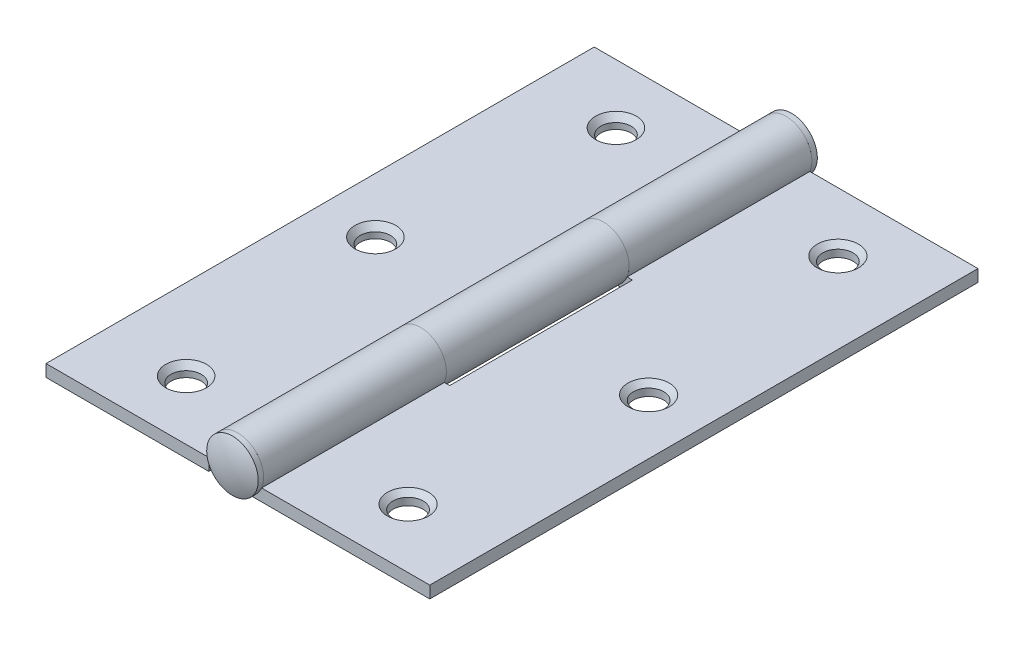
ISO-10303-21;
HEADER;
FILE_DESCRIPTION(('STEP AP214'),'2;1');
FILE_NAME('part.step','',(''),(''),'','','');
FILE_SCHEMA(('AUTOMOTIVE_DESIGN { 1 0 10303 214 1 1 1 1 }'));
ENDSEC;
DATA;
#1=APPLICATION_CONTEXT('core data for automotive mechanical design processes');
#2=APPLICATION_PROTOCOL_DEFINITION('international standard','automotive_design',2000,#1);
#3=PRODUCT_CONTEXT('',#1,'mechanical');
#4=PRODUCT('Part','Part','',(#3));
#5=PRODUCT_RELATED_PRODUCT_CATEGORY('part','',(#4));
#6=PRODUCT_DEFINITION_FORMATION('','',#4);
#7=PRODUCT_DEFINITION_CONTEXT('part definition',#1,'design');
#8=PRODUCT_DEFINITION('design','',#6,#7);
#9=PRODUCT_DEFINITION_SHAPE('','',#8);
#10=(LENGTH_UNIT() NAMED_UNIT(*) SI_UNIT(.MILLI.,.METRE.));
#11=(NAMED_UNIT(*) PLANE_ANGLE_UNIT() SI_UNIT($,.RADIAN.));
#12=(NAMED_UNIT(*) SI_UNIT($,.STERADIAN.) SOLID_ANGLE_UNIT());
#13=UNCERTAINTY_MEASURE_WITH_UNIT(LENGTH_MEASURE(1.E-05),#10,'distance_accuracy_value','');
#14=(GEOMETRIC_REPRESENTATION_CONTEXT(3) GLOBAL_UNCERTAINTY_ASSIGNED_CONTEXT((#13)) GLOBAL_UNIT_ASSIGNED_CONTEXT((#10,
#11,#12)) REPRESENTATION_CONTEXT('',''));
#15=CARTESIAN_POINT('',(0.,0.,0.));
#16=DIRECTION('',(0.,0.,1.));
#17=DIRECTION('',(1.,0.,0.));
#18=AXIS2_PLACEMENT_3D('',#15,#16,#17);
#19=CARTESIAN_POINT('',(0.,0.,-19.2983468731966));
#20=DIRECTION('',(0.,0.,1.));
#21=DIRECTION('',(1.,0.,0.));
#22=AXIS2_PLACEMENT_3D('',#19,#20,#21);
#23=CYLINDRICAL_SURFACE('',#22,2.9845);
#24=DIRECTION('',(0.,0.,1.));
#25=VECTOR('',#24,1.);
#26=CARTESIAN_POINT('',(-1.524,-2.56606006359945,-19.2983468731966));
#27=LINE('',#26,#25);
#28=CARTESIAN_POINT('',(-1.524,-2.56606006359945,-10.5833333333333));
#29=VERTEX_POINT('',#28);
#30=CARTESIAN_POINT('',(-1.524,-2.56606006359945,10.5833333333333));
#31=VERTEX_POINT('',#30);
#32=EDGE_CURVE('E209',#29,#31,#27,.T.);
#33=ORIENTED_EDGE('',*,*,#32,.F.);
#34=CARTESIAN_POINT('',(0.,0.,-10.5833333333333));
#35=DIRECTION('',(0.,0.,-1.));
#36=DIRECTION('',(-1.,0.,0.));
#37=AXIS2_PLACEMENT_3D('',#34,#35,#36);
#38=CIRCLE('',#37,2.9845);
#39=CARTESIAN_POINT('',(-2.74600415471223,-1.16906006359945,-10.5833333333333));
#40=VERTEX_POINT('',#39);
#41=EDGE_CURVE('E67',#29,#40,#38,.F.);
#42=ORIENTED_EDGE('',*,*,#41,.T.);
#43=DIRECTION('',(0.,0.,1.));
#44=VECTOR('',#43,1.);
#45=CARTESIAN_POINT('',(-2.74600415471223,-1.16906006359945,-19.2983468731966));
#46=LINE('',#45,#44);
#47=CARTESIAN_POINT('',(-2.74600415471223,-1.16906006359945,10.5833333333333));
#48=VERTEX_POINT('',#47);
#49=EDGE_CURVE('E51',#40,#48,#46,.T.);
#50=ORIENTED_EDGE('',*,*,#49,.T.);
#51=CARTESIAN_POINT('',(0.,0.,10.5833333333333));
#52=DIRECTION('',(0.,0.,1.));
#53=DIRECTION('',(1.,0.,0.));
#54=AXIS2_PLACEMENT_3D('',#51,#52,#53);
#55=CIRCLE('',#54,2.9845);
#56=EDGE_CURVE('E189',#31,#48,#55,.T.);
#57=ORIENTED_EDGE('',*,*,#56,.F.);
#58=EDGE_LOOP('',(#33,#42,#50,#57));
#59=FACE_BOUND('',#58,.T.);
#60=ADVANCED_FACE('F47',(#59),#23,.T.);
#61=CARTESIAN_POINT('',(-3.3655,-2.56606006359945,-19.2983468731966));
#62=DIRECTION('',(0.,-1.,0.));
#63=DIRECTION('',(1.,0.,0.));
#64=AXIS2_PLACEMENT_3D('',#61,#62,#63);
#65=PLANE('',#64);
#66=DIRECTION('',(1.,0.,0.));
#67=VECTOR('',#66,1.);
#68=CARTESIAN_POINT('',(-3.3655,-2.56606006359945,10.5833333333333));
#69=LINE('',#68,#67);
#70=CARTESIAN_POINT('',(-3.3655,-2.56606006359945,10.5833333333333));
#71=VERTEX_POINT('',#70);
#72=EDGE_CURVE('E192',#71,#31,#69,.T.);
#73=ORIENTED_EDGE('',*,*,#72,.F.);
#74=DIRECTION('',(0.,0.,1.));
#75=VECTOR('',#74,1.);
#76=CARTESIAN_POINT('',(-3.3655,-2.56606006359945,-31.75));
#77=LINE('',#76,#75);
#78=CARTESIAN_POINT('',(-3.3655,-2.56606006359945,31.75));
#79=VERTEX_POINT('',#78);
#80=EDGE_CURVE('E164',#71,#79,#77,.T.);
#81=ORIENTED_EDGE('',*,*,#80,.T.);
#82=DIRECTION('',(1.,0.,0.));
#83=VECTOR('',#82,1.);
#84=CARTESIAN_POINT('',(-22.225,-2.56606006359945,31.75));
#85=LINE('',#84,#83);
#86=CARTESIAN_POINT('',(-22.225,-2.56606006359945,31.75));
#87=VERTEX_POINT('',#86);
#88=EDGE_CURVE('E135',#87,#79,#85,.T.);
#89=ORIENTED_EDGE('',*,*,#88,.F.);
#90=DIRECTION('',(0.,0.,1.));
#91=VECTOR('',#90,1.);
#92=CARTESIAN_POINT('',(-22.225,-2.56606006359945,-31.75));
#93=LINE('',#92,#91);
#94=CARTESIAN_POINT('',(-22.225,-2.56606006359945,-31.75));
#95=VERTEX_POINT('',#94);
#96=EDGE_CURVE('E126',#95,#87,#93,.T.);
#97=ORIENTED_EDGE('',*,*,#96,.F.);
#98=DIRECTION('',(1.,0.,0.));
#99=VECTOR('',#98,1.);
#100=CARTESIAN_POINT('',(-22.225,-2.56606006359945,-31.75));
#101=LINE('',#100,#99);
#102=CARTESIAN_POINT('',(-3.3655,-2.56606006359945,-31.75));
#103=VERTEX_POINT('',#102);
#104=EDGE_CURVE('E152',#95,#103,#101,.T.);
#105=ORIENTED_EDGE('',*,*,#104,.T.);
#106=CARTESIAN_POINT('',(-3.3655,-2.56606006359945,-10.5833333333333));
#107=VERTEX_POINT('',#106);
#108=EDGE_CURVE('E161',#103,#107,#77,.T.);
#109=ORIENTED_EDGE('',*,*,#108,.T.);
#110=DIRECTION('',(1.,0.,0.));
#111=VECTOR('',#110,1.);
#112=CARTESIAN_POINT('',(-3.3655,-2.56606006359945,-10.5833333333333));
#113=LINE('',#112,#111);
#114=EDGE_CURVE('E206',#107,#29,#113,.T.);
#115=ORIENTED_EDGE('',*,*,#114,.T.);
#116=ORIENTED_EDGE('',*,*,#32,.T.);
#117=EDGE_LOOP('',(#73,#81,#89,#97,#105,#109,#115,#116));
#118=FACE_BOUND('',#117,.T.);
#119=CARTESIAN_POINT('',(-12.8524,-2.56606006359945,-24.892));
#120=DIRECTION('',(0.,-1.,0.));
#121=DIRECTION('',(0.,0.,-1.));
#122=AXIS2_PLACEMENT_3D('',#119,#120,#121);
#123=CIRCLE('',#122,1.7526);
#124=CARTESIAN_POINT('',(-12.8524,-2.56606006359945,-26.6446));
#125=VERTEX_POINT('',#124);
#126=EDGE_CURVE('E141',#125,#125,#123,.T.);
#127=ORIENTED_EDGE('',*,*,#126,.F.);
#128=EDGE_LOOP('',(#127));
#129=FACE_BOUND('',#128,.T.);
#130=CARTESIAN_POINT('',(-12.8524,-2.56606006359945,24.892));
#131=DIRECTION('',(0.,-1.,0.));
#132=DIRECTION('',(0.,0.,-1.));
#133=AXIS2_PLACEMENT_3D('',#130,#131,#132);
#134=CIRCLE('',#133,1.7526);
#135=CARTESIAN_POINT('',(-12.8524,-2.56606006359945,23.1394));
#136=VERTEX_POINT('',#135);
#137=EDGE_CURVE('E144',#136,#136,#134,.T.);
#138=ORIENTED_EDGE('',*,*,#137,.F.);
#139=EDGE_LOOP('',(#138));
#140=FACE_BOUND('',#139,.T.);
#141=CARTESIAN_POINT('',(-15.8242,-2.56606006359945,0.));
#142=DIRECTION('',(0.,-1.,0.));
#143=DIRECTION('',(0.,0.,-1.));
#144=AXIS2_PLACEMENT_3D('',#141,#142,#143);
#145=CIRCLE('',#144,1.7526);
#146=CARTESIAN_POINT('',(-15.8242,-2.56606006359945,-1.7526));
#147=VERTEX_POINT('',#146);
#148=EDGE_CURVE('E166',#147,#147,#145,.T.);
#149=ORIENTED_EDGE('',*,*,#148,.F.);
#150=EDGE_LOOP('',(#149));
#151=FACE_BOUND('',#150,.T.);
#152=ADVANCED_FACE('F213',(#118,#129,#140,#151),#65,.T.);
#153=CARTESIAN_POINT('',(-2.74600415471223,-1.16906006359945,-19.2983468731966));
#154=DIRECTION('',(0.,1.,0.));
#155=DIRECTION('',(0.,0.,1.));
#156=AXIS2_PLACEMENT_3D('',#153,#154,#155);
#157=PLANE('',#156);
#158=ORIENTED_EDGE('',*,*,#49,.F.);
#159=DIRECTION('',(-1.,0.,0.));
#160=VECTOR('',#159,1.);
#161=CARTESIAN_POINT('',(-2.74600415471223,-1.16906006359945,-10.5833333333333));
#162=LINE('',#161,#160);
#163=CARTESIAN_POINT('',(-3.3655,-1.16906006359945,-10.5833333333333));
#164=VERTEX_POINT('',#163);
#165=EDGE_CURVE('E56',#40,#164,#162,.T.);
#166=ORIENTED_EDGE('',*,*,#165,.T.);
#167=DIRECTION('',(0.,0.,1.));
#168=VECTOR('',#167,1.);
#169=CARTESIAN_POINT('',(-3.3655,-1.16906006359945,-31.75));
#170=LINE('',#169,#168);
#171=CARTESIAN_POINT('',(-3.3655,-1.16906006359945,-31.75));
#172=VERTEX_POINT('',#171);
#173=EDGE_CURVE('E157',#172,#164,#170,.T.);
#174=ORIENTED_EDGE('',*,*,#173,.F.);
#175=DIRECTION('',(-1.,0.,0.));
#176=VECTOR('',#175,1.);
#177=CARTESIAN_POINT('',(-22.225,-1.16906006359945,-31.75));
#178=LINE('',#177,#176);
#179=CARTESIAN_POINT('',(-22.225,-1.16906006359945,-31.75));
#180=VERTEX_POINT('',#179);
#181=EDGE_CURVE('E122',#172,#180,#178,.T.);
#182=ORIENTED_EDGE('',*,*,#181,.T.);
#183=DIRECTION('',(0.,0.,1.));
#184=VECTOR('',#183,1.);
#185=CARTESIAN_POINT('',(-22.225,-1.16906006359945,-31.75));
#186=LINE('',#185,#184);
#187=CARTESIAN_POINT('',(-22.225,-1.16906006359945,31.75));
#188=VERTEX_POINT('',#187);
#189=EDGE_CURVE('E113',#180,#188,#186,.T.);
#190=ORIENTED_EDGE('',*,*,#189,.T.);
#191=DIRECTION('',(-1.,0.,0.));
#192=VECTOR('',#191,1.);
#193=CARTESIAN_POINT('',(-22.225,-1.16906006359945,31.75));
#194=LINE('',#193,#192);
#195=CARTESIAN_POINT('',(-3.3655,-1.16906006359945,31.75));
#196=VERTEX_POINT('',#195);
#197=EDGE_CURVE('E120',#196,#188,#194,.T.);
#198=ORIENTED_EDGE('',*,*,#197,.F.);
#199=CARTESIAN_POINT('',(-3.3655,-1.16906006359945,10.5833333333333));
#200=VERTEX_POINT('',#199);
#201=EDGE_CURVE('E160',#200,#196,#170,.T.);
#202=ORIENTED_EDGE('',*,*,#201,.F.);
#203=DIRECTION('',(-1.,0.,0.));
#204=VECTOR('',#203,1.);
#205=CARTESIAN_POINT('',(-2.74600415471223,-1.16906006359945,10.5833333333333));
#206=LINE('',#205,#204);
#207=EDGE_CURVE('E198',#48,#200,#206,.T.);
#208=ORIENTED_EDGE('',*,*,#207,.F.);
#209=EDGE_LOOP('',(#158,#166,#174,#182,#190,#198,#202,#208));
#210=FACE_BOUND('',#209,.T.);
#211=CARTESIAN_POINT('',(-12.8524,-1.16906006359945,-24.892));
#212=DIRECTION('',(0.,1.,0.));
#213=DIRECTION('',(0.,0.,1.));
#214=AXIS2_PLACEMENT_3D('',#211,#212,#213);
#215=CIRCLE('',#214,2.35979678636464);
#216=CARTESIAN_POINT('',(-12.8524,-1.16906006359945,-22.5322032136354));
#217=VERTEX_POINT('',#216);
#218=EDGE_CURVE('E179',#217,#217,#215,.F.);
#219=ORIENTED_EDGE('',*,*,#218,.T.);
#220=EDGE_LOOP('',(#219));
#221=FACE_BOUND('',#220,.T.);
#222=CARTESIAN_POINT('',(-15.8242,-1.16906006359945,0.));
#223=DIRECTION('',(0.,1.,0.));
#224=DIRECTION('',(0.,0.,1.));
#225=AXIS2_PLACEMENT_3D('',#222,#223,#224);
#226=CIRCLE('',#225,2.35979678636464);
#227=CARTESIAN_POINT('',(-15.8242,-1.16906006359945,2.35979678636464));
#228=VERTEX_POINT('',#227);
#229=EDGE_CURVE('E176',#228,#228,#226,.F.);
#230=ORIENTED_EDGE('',*,*,#229,.T.);
#231=EDGE_LOOP('',(#230));
#232=FACE_BOUND('',#231,.T.);
#233=CARTESIAN_POINT('',(-12.8524,-1.16906006359945,24.892));
#234=DIRECTION('',(0.,1.,0.));
#235=DIRECTION('',(0.,0.,1.));
#236=AXIS2_PLACEMENT_3D('',#233,#234,#235);
#237=CIRCLE('',#236,2.35979678636464);
#238=CARTESIAN_POINT('',(-12.8524,-1.16906006359945,27.2517967863646));
#239=VERTEX_POINT('',#238);
#240=EDGE_CURVE('E173',#239,#239,#237,.F.);
#241=ORIENTED_EDGE('',*,*,#240,.T.);
#242=EDGE_LOOP('',(#241));
#243=FACE_BOUND('',#242,.T.);
#244=ADVANCED_FACE('F116',(#210,#221,#232,#243),#157,.T.);
#245=CARTESIAN_POINT('',(0.,0.,-19.2983468731966));
#246=DIRECTION('',(0.,0.,1.));
#247=DIRECTION('',(1.,0.,0.));
#248=AXIS2_PLACEMENT_3D('',#245,#246,#247);
#249=CYLINDRICAL_SURFACE('',#248,1.524);
#250=CARTESIAN_POINT('',(0.,0.,-10.5833333333333));
#251=DIRECTION('',(0.,0.,-1.));
#252=DIRECTION('',(-1.,0.,0.));
#253=AXIS2_PLACEMENT_3D('',#250,#251,#252);
#254=CIRCLE('',#253,1.524);
#255=CARTESIAN_POINT('',(-1.524,0.,-10.5833333333333));
#256=VERTEX_POINT('',#255);
#257=EDGE_CURVE('E12',#256,#256,#254,.F.);
#258=ORIENTED_EDGE('',*,*,#257,.F.);
#259=EDGE_LOOP('',(#258));
#260=FACE_BOUND('',#259,.T.);
#261=CARTESIAN_POINT('',(0.,0.,10.5833333333333));
#262=DIRECTION('',(0.,0.,1.));
#263=DIRECTION('',(1.,0.,0.));
#264=AXIS2_PLACEMENT_3D('',#261,#262,#263);
#265=CIRCLE('',#264,1.524);
#266=CARTESIAN_POINT('',(1.524,0.,10.5833333333333));
#267=VERTEX_POINT('',#266);
#268=EDGE_CURVE('E188',#267,#267,#265,.T.);
#269=ORIENTED_EDGE('',*,*,#268,.T.);
#270=EDGE_LOOP('',(#269));
#271=FACE_BOUND('',#270,.T.);
#272=ADVANCED_FACE('F229',(#260,#271),#249,.F.);
#273=CARTESIAN_POINT('',(-3.3655,-2.9845,-10.5833333333333));
#274=DIRECTION('',(0.,0.,-1.));
#275=DIRECTION('',(-1.,0.,0.));
#276=AXIS2_PLACEMENT_3D('',#273,#274,#275);
#277=PLANE('',#276);
#278=ORIENTED_EDGE('',*,*,#41,.F.);
#279=ORIENTED_EDGE('',*,*,#114,.F.);
#280=DIRECTION('',(0.,-1.,0.));
#281=VECTOR('',#280,1.);
#282=CARTESIAN_POINT('',(-3.3655,-1.16906006359945,-10.5833333333333));
#283=LINE('',#282,#281);
#284=EDGE_CURVE('E204',#164,#107,#283,.T.);
#285=ORIENTED_EDGE('',*,*,#284,.F.);
#286=ORIENTED_EDGE('',*,*,#165,.F.);
#287=EDGE_LOOP('',(#278,#279,#285,#286));
#288=FACE_BOUND('',#287,.T.);
#289=ORIENTED_EDGE('',*,*,#257,.T.);
#290=EDGE_LOOP('',(#289));
#291=FACE_BOUND('',#290,.T.);
#292=ADVANCED_FACE('F49',(#288,#291),#277,.T.);
#293=CARTESIAN_POINT('',(-3.3655,-2.9845,10.5833333333333));
#294=DIRECTION('',(0.,0.,1.));
#295=DIRECTION('',(1.,0.,0.));
#296=AXIS2_PLACEMENT_3D('',#293,#294,#295);
#297=PLANE('',#296);
#298=ORIENTED_EDGE('',*,*,#268,.F.);
#299=EDGE_LOOP('',(#298));
#300=FACE_BOUND('',#299,.T.);
#301=ORIENTED_EDGE('',*,*,#56,.T.);
#302=ORIENTED_EDGE('',*,*,#207,.T.);
#303=DIRECTION('',(0.,-1.,0.));
#304=VECTOR('',#303,1.);
#305=CARTESIAN_POINT('',(-3.3655,-1.16906006359945,10.5833333333333));
#306=LINE('',#305,#304);
#307=EDGE_CURVE('E195',#200,#71,#306,.T.);
#308=ORIENTED_EDGE('',*,*,#307,.T.);
#309=ORIENTED_EDGE('',*,*,#72,.T.);
#310=EDGE_LOOP('',(#301,#302,#308,#309));
#311=FACE_BOUND('',#310,.T.);
#312=ADVANCED_FACE('F218',(#300,#311),#297,.T.);
#313=CARTESIAN_POINT('',(-3.3655,-1.16906006359945,-31.75));
#314=DIRECTION('',(1.,0.,0.));
#315=DIRECTION('',(0.,1.,0.));
#316=AXIS2_PLACEMENT_3D('',#313,#314,#315);
#317=PLANE('',#316);
#318=ORIENTED_EDGE('',*,*,#307,.F.);
#319=ORIENTED_EDGE('',*,*,#201,.T.);
#320=DIRECTION('',(0.,1.,0.));
#321=VECTOR('',#320,1.);
#322=CARTESIAN_POINT('',(-3.3655,-1.16906006359945,31.75));
#323=LINE('',#322,#321);
#324=EDGE_CURVE('E140',#79,#196,#323,.T.);
#325=ORIENTED_EDGE('',*,*,#324,.F.);
#326=ORIENTED_EDGE('',*,*,#80,.F.);
#327=EDGE_LOOP('',(#318,#319,#325,#326));
#328=FACE_BOUND('',#327,.T.);
#329=ADVANCED_FACE('F220',(#328),#317,.T.);
#330=ORIENTED_EDGE('',*,*,#173,.T.);
#331=ORIENTED_EDGE('',*,*,#284,.T.);
#332=ORIENTED_EDGE('',*,*,#108,.F.);
#333=DIRECTION('',(0.,1.,0.));
#334=VECTOR('',#333,1.);
#335=CARTESIAN_POINT('',(-3.3655,-1.16906006359945,-31.75));
#336=LINE('',#335,#334);
#337=EDGE_CURVE('E127',#103,#172,#336,.T.);
#338=ORIENTED_EDGE('',*,*,#337,.T.);
#339=EDGE_LOOP('',(#330,#331,#332,#338));
#340=FACE_BOUND('',#339,.T.);
#341=ADVANCED_FACE('F226',(#340),#317,.T.);
#342=CARTESIAN_POINT('',(-22.225,-1.16906006359945,-31.75));
#343=DIRECTION('',(-1.,0.,0.));
#344=DIRECTION('',(0.,0.,1.));
#345=AXIS2_PLACEMENT_3D('',#342,#343,#344);
#346=PLANE('',#345);
#347=ORIENTED_EDGE('',*,*,#96,.T.);
#348=DIRECTION('',(0.,-1.,0.));
#349=VECTOR('',#348,1.);
#350=CARTESIAN_POINT('',(-22.225,-1.16906006359945,31.75));
#351=LINE('',#350,#349);
#352=EDGE_CURVE('E130',#188,#87,#351,.T.);
#353=ORIENTED_EDGE('',*,*,#352,.F.);
#354=ORIENTED_EDGE('',*,*,#189,.F.);
#355=DIRECTION('',(0.,-1.,0.));
#356=VECTOR('',#355,1.);
#357=CARTESIAN_POINT('',(-22.225,-1.16906006359945,-31.75));
#358=LINE('',#357,#356);
#359=EDGE_CURVE('E150',#180,#95,#358,.T.);
#360=ORIENTED_EDGE('',*,*,#359,.T.);
#361=EDGE_LOOP('',(#347,#353,#354,#360));
#362=FACE_BOUND('',#361,.T.);
#363=ADVANCED_FACE('F131',(#362),#346,.T.);
#364=CARTESIAN_POINT('',(0.,0.,-31.75));
#365=DIRECTION('',(0.,0.,-1.));
#366=DIRECTION('',(-1.,0.,0.));
#367=AXIS2_PLACEMENT_3D('',#364,#365,#366);
#368=PLANE('',#367);
#369=ORIENTED_EDGE('',*,*,#181,.F.);
#370=ORIENTED_EDGE('',*,*,#337,.F.);
#371=ORIENTED_EDGE('',*,*,#104,.F.);
#372=ORIENTED_EDGE('',*,*,#359,.F.);
#373=EDGE_LOOP('',(#369,#370,#371,#372));
#374=FACE_BOUND('',#373,.T.);
#375=ADVANCED_FACE('F224',(#374),#368,.T.);
#376=CARTESIAN_POINT('',(0.,0.,31.75));
#377=DIRECTION('',(0.,0.,-1.));
#378=DIRECTION('',(-1.,0.,0.));
#379=AXIS2_PLACEMENT_3D('',#376,#377,#378);
#380=PLANE('',#379);
#381=ORIENTED_EDGE('',*,*,#197,.T.);
#382=ORIENTED_EDGE('',*,*,#352,.T.);
#383=ORIENTED_EDGE('',*,*,#88,.T.);
#384=ORIENTED_EDGE('',*,*,#324,.T.);
#385=EDGE_LOOP('',(#381,#382,#383,#384));
#386=FACE_BOUND('',#385,.T.);
#387=ADVANCED_FACE('F138',(#386),#380,.F.);
#388=CARTESIAN_POINT('',(-15.8242,-3.70906006359945,0.));
#389=DIRECTION('',(0.,1.,0.));
#390=DIRECTION('',(-1.,0.,0.));
#391=AXIS2_PLACEMENT_3D('',#388,#389,#390);
#392=CYLINDRICAL_SURFACE('',#391,1.7526);
#393=CARTESIAN_POINT('',(-15.8242,-1.86756006359946,0.));
#394=DIRECTION('',(0.,1.,0.));
#395=DIRECTION('',(0.,0.,1.));
#396=AXIS2_PLACEMENT_3D('',#393,#394,#395);
#397=CIRCLE('',#396,1.7526);
#398=CARTESIAN_POINT('',(-15.8242,-1.86756006359946,1.7526));
#399=VERTEX_POINT('',#398);
#400=EDGE_CURVE('E182',#399,#399,#397,.T.);
#401=ORIENTED_EDGE('',*,*,#400,.T.);
#402=EDGE_LOOP('',(#401));
#403=FACE_BOUND('',#402,.T.);
#404=ORIENTED_EDGE('',*,*,#148,.T.);
#405=EDGE_LOOP('',(#404));
#406=FACE_BOUND('',#405,.T.);
#407=ADVANCED_FACE('F298',(#403,#406),#392,.F.);
#408=CARTESIAN_POINT('',(-12.8524,-3.70906006359945,24.892));
#409=DIRECTION('',(0.,1.,0.));
#410=DIRECTION('',(-1.,0.,0.));
#411=AXIS2_PLACEMENT_3D('',#408,#409,#410);
#412=CYLINDRICAL_SURFACE('',#411,1.7526);
#413=CARTESIAN_POINT('',(-12.8524,-1.86756006359946,24.892));
#414=DIRECTION('',(0.,1.,0.));
#415=DIRECTION('',(0.,0.,1.));
#416=AXIS2_PLACEMENT_3D('',#413,#414,#415);
#417=CIRCLE('',#416,1.7526);
#418=CARTESIAN_POINT('',(-12.8524,-1.86756006359946,26.6446));
#419=VERTEX_POINT('',#418);
#420=EDGE_CURVE('E185',#419,#419,#417,.T.);
#421=ORIENTED_EDGE('',*,*,#420,.T.);
#422=EDGE_LOOP('',(#421));
#423=FACE_BOUND('',#422,.T.);
#424=ORIENTED_EDGE('',*,*,#137,.T.);
#425=EDGE_LOOP('',(#424));
#426=FACE_BOUND('',#425,.T.);
#427=ADVANCED_FACE('F306',(#423,#426),#412,.F.);
#428=CARTESIAN_POINT('',(-12.8524,-3.70906006359945,-24.892));
#429=DIRECTION('',(0.,1.,0.));
#430=DIRECTION('',(-1.,0.,0.));
#431=AXIS2_PLACEMENT_3D('',#428,#429,#430);
#432=CYLINDRICAL_SURFACE('',#431,1.7526);
#433=CARTESIAN_POINT('',(-12.8524,-1.86756006359946,-24.892));
#434=DIRECTION('',(0.,1.,0.));
#435=DIRECTION('',(0.,0.,1.));
#436=AXIS2_PLACEMENT_3D('',#433,#434,#435);
#437=CIRCLE('',#436,1.7526);
#438=CARTESIAN_POINT('',(-12.8524,-1.86756006359946,-23.1394));
#439=VERTEX_POINT('',#438);
#440=EDGE_CURVE('E159',#439,#439,#437,.T.);
#441=ORIENTED_EDGE('',*,*,#440,.T.);
#442=EDGE_LOOP('',(#441));
#443=FACE_BOUND('',#442,.T.);
#444=ORIENTED_EDGE('',*,*,#126,.T.);
#445=EDGE_LOOP('',(#444));
#446=FACE_BOUND('',#445,.T.);
#447=ADVANCED_FACE('F315',(#443,#446),#432,.F.);
#448=CARTESIAN_POINT('',(-12.8524,-1.86756006359946,-24.892));
#449=DIRECTION('',(0.,1.,0.));
#450=DIRECTION('',(0.,0.,1.));
#451=AXIS2_PLACEMENT_3D('',#448,#449,#450);
#452=CONICAL_SURFACE('',#451,1.7526,0.715584993317677);
#453=ORIENTED_EDGE('',*,*,#218,.F.);
#454=EDGE_LOOP('',(#453));
#455=FACE_BOUND('',#454,.T.);
#456=ORIENTED_EDGE('',*,*,#440,.F.);
#457=EDGE_LOOP('',(#456));
#458=FACE_BOUND('',#457,.T.);
#459=ADVANCED_FACE('F324',(#455,#458),#452,.F.);
#460=CARTESIAN_POINT('',(-15.8242,-1.86756006359946,0.));
#461=DIRECTION('',(0.,1.,0.));
#462=DIRECTION('',(0.,0.,1.));
#463=AXIS2_PLACEMENT_3D('',#460,#461,#462);
#464=CONICAL_SURFACE('',#463,1.7526,0.715584993317677);
#465=ORIENTED_EDGE('',*,*,#229,.F.);
#466=EDGE_LOOP('',(#465));
#467=FACE_BOUND('',#466,.T.);
#468=ORIENTED_EDGE('',*,*,#400,.F.);
#469=EDGE_LOOP('',(#468));
#470=FACE_BOUND('',#469,.T.);
#471=ADVANCED_FACE('F333',(#467,#470),#464,.F.);
#472=CARTESIAN_POINT('',(-12.8524,-1.86756006359946,24.892));
#473=DIRECTION('',(0.,1.,0.));
#474=DIRECTION('',(0.,0.,1.));
#475=AXIS2_PLACEMENT_3D('',#472,#473,#474);
#476=CONICAL_SURFACE('',#475,1.7526,0.715584993317677);
#477=ORIENTED_EDGE('',*,*,#240,.F.);
#478=EDGE_LOOP('',(#477));
#479=FACE_BOUND('',#478,.T.);
#480=ORIENTED_EDGE('',*,*,#420,.F.);
#481=EDGE_LOOP('',(#480));
#482=FACE_BOUND('',#481,.T.);
#483=ADVANCED_FACE('F342',(#479,#482),#476,.F.);
#484=CLOSED_SHELL('',(#60,#152,#244,#272,#292,#312,#329,#341,#363,#375,#387,#407,#427,#447,#459,
#471,#483));
#485=MANIFOLD_SOLID_BREP('B2',#484);
#486=CARTESIAN_POINT('',(0.,0.,-33.0073));
#487=DIRECTION('',(0.,0.,-1.));
#488=DIRECTION('',(-1.,0.,0.));
#489=AXIS2_PLACEMENT_3D('',#486,#487,#488);
#490=CYLINDRICAL_SURFACE('',#489,2.9845);
#491=CARTESIAN_POINT('',(0.,0.,32.37865));
#492=DIRECTION('',(0.,0.,-1.));
#493=DIRECTION('',(-1.,0.,0.));
#494=AXIS2_PLACEMENT_3D('',#491,#492,#493);
#495=CIRCLE('',#494,2.9845);
#496=CARTESIAN_POINT('',(-2.98450000000001,0.,32.37865));
#497=VERTEX_POINT('',#496);
#498=EDGE_CURVE('E46',#497,#497,#495,.T.);
#499=ORIENTED_EDGE('',*,*,#498,.T.);
#500=EDGE_LOOP('',(#499));
#501=FACE_BOUND('',#500,.T.);
#502=CARTESIAN_POINT('',(0.,0.,31.75));
#503=DIRECTION('',(0.,0.,-1.));
#504=DIRECTION('',(-1.,0.,0.));
#505=AXIS2_PLACEMENT_3D('',#502,#503,#504);
#506=CIRCLE('',#505,2.9845);
#507=CARTESIAN_POINT('',(-2.9845,0.,31.75));
#508=VERTEX_POINT('',#507);
#509=EDGE_CURVE('E458',#508,#508,#506,.T.);
#510=ORIENTED_EDGE('',*,*,#509,.F.);
#511=EDGE_LOOP('',(#510));
#512=FACE_BOUND('',#511,.T.);
#513=ADVANCED_FACE('F436',(#501,#512),#490,.T.);
#514=CARTESIAN_POINT('',(0.,0.,25.6085558080807));
#515=DIRECTION('',(0.,0.,-1.));
#516=DIRECTION('',(-1.,0.,0.));
#517=AXIS2_PLACEMENT_3D('',#514,#515,#516);
#518=SPHERICAL_SURFACE('',#517,7.3987441919193);
#519=ORIENTED_EDGE('',*,*,#498,.F.);
#520=EDGE_LOOP('',(#519));
#521=FACE_BOUND('',#520,.T.);
#522=ADVANCED_FACE('F466',(#521),#518,.T.);
#523=CARTESIAN_POINT('',(0.,0.,-25.6085558080807));
#524=DIRECTION('',(0.,0.,-1.));
#525=DIRECTION('',(-1.,0.,0.));
#526=AXIS2_PLACEMENT_3D('',#523,#524,#525);
#527=SPHERICAL_SURFACE('',#526,7.3987441919193);
#528=CARTESIAN_POINT('',(0.,0.,-32.37865));
#529=DIRECTION('',(0.,0.,-1.));
#530=DIRECTION('',(-1.,0.,0.));
#531=AXIS2_PLACEMENT_3D('',#528,#529,#530);
#532=CIRCLE('',#531,2.9845);
#533=CARTESIAN_POINT('',(-2.98450000000001,0.,-32.37865));
#534=VERTEX_POINT('',#533);
#535=EDGE_CURVE('E442',#534,#534,#532,.T.);
#536=ORIENTED_EDGE('',*,*,#535,.T.);
#537=EDGE_LOOP('',(#536));
#538=FACE_BOUND('',#537,.T.);
#539=ADVANCED_FACE('F470',(#538),#527,.T.);
#540=CARTESIAN_POINT('',(0.,0.,-33.0073));
#541=DIRECTION('',(0.,0.,-1.));
#542=DIRECTION('',(-1.,0.,0.));
#543=AXIS2_PLACEMENT_3D('',#540,#541,#542);
#544=CYLINDRICAL_SURFACE('',#543,2.9845);
#545=CARTESIAN_POINT('',(0.,0.,-31.75));
#546=DIRECTION('',(0.,0.,-1.));
#547=DIRECTION('',(-1.,0.,0.));
#548=AXIS2_PLACEMENT_3D('',#545,#546,#547);
#549=CIRCLE('',#548,2.9845);
#550=CARTESIAN_POINT('',(-2.9845,0.,-31.75));
#551=VERTEX_POINT('',#550);
#552=EDGE_CURVE('E446',#551,#551,#549,.T.);
#553=ORIENTED_EDGE('',*,*,#552,.T.);
#554=EDGE_LOOP('',(#553));
#555=FACE_BOUND('',#554,.T.);
#556=ORIENTED_EDGE('',*,*,#535,.F.);
#557=EDGE_LOOP('',(#556));
#558=FACE_BOUND('',#557,.T.);
#559=ADVANCED_FACE('F475',(#555,#558),#544,.T.);
#560=CARTESIAN_POINT('',(0.,0.,-31.75));
#561=DIRECTION('',(0.,0.,1.));
#562=DIRECTION('',(1.,0.,0.));
#563=AXIS2_PLACEMENT_3D('',#560,#561,#562);
#564=PLANE('',#563);
#565=CARTESIAN_POINT('',(0.,0.,-31.75));
#566=DIRECTION('',(0.,0.,-1.));
#567=DIRECTION('',(-1.,0.,0.));
#568=AXIS2_PLACEMENT_3D('',#565,#566,#567);
#569=CIRCLE('',#568,1.524);
#570=CARTESIAN_POINT('',(-1.524,0.,-31.75));
#571=VERTEX_POINT('',#570);
#572=EDGE_CURVE('E450',#571,#571,#569,.T.);
#573=ORIENTED_EDGE('',*,*,#572,.T.);
#574=EDGE_LOOP('',(#573));
#575=FACE_BOUND('',#574,.T.);
#576=ORIENTED_EDGE('',*,*,#552,.F.);
#577=EDGE_LOOP('',(#576));
#578=FACE_BOUND('',#577,.T.);
#579=ADVANCED_FACE('F480',(#575,#578),#564,.T.);
#580=CARTESIAN_POINT('',(0.,0.,-33.0073));
#581=DIRECTION('',(0.,0.,-1.));
#582=DIRECTION('',(-1.,0.,0.));
#583=AXIS2_PLACEMENT_3D('',#580,#581,#582);
#584=CYLINDRICAL_SURFACE('',#583,1.524);
#585=CARTESIAN_POINT('',(0.,0.,31.75));
#586=DIRECTION('',(0.,0.,-1.));
#587=DIRECTION('',(-1.,0.,0.));
#588=AXIS2_PLACEMENT_3D('',#585,#586,#587);
#589=CIRCLE('',#588,1.524);
#590=CARTESIAN_POINT('',(-1.524,0.,31.75));
#591=VERTEX_POINT('',#590);
#592=EDGE_CURVE('E455',#591,#591,#589,.T.);
#593=ORIENTED_EDGE('',*,*,#592,.T.);
#594=EDGE_LOOP('',(#593));
#595=FACE_BOUND('',#594,.T.);
#596=ORIENTED_EDGE('',*,*,#572,.F.);
#597=EDGE_LOOP('',(#596));
#598=FACE_BOUND('',#597,.T.);
#599=ADVANCED_FACE('F484',(#595,#598),#584,.T.);
#600=CARTESIAN_POINT('',(0.,0.,31.75));
#601=DIRECTION('',(0.,0.,-1.));
#602=DIRECTION('',(-1.,0.,0.));
#603=AXIS2_PLACEMENT_3D('',#600,#601,#602);
#604=PLANE('',#603);
#605=ORIENTED_EDGE('',*,*,#509,.T.);
#606=EDGE_LOOP('',(#605));
#607=FACE_BOUND('',#606,.T.);
#608=ORIENTED_EDGE('',*,*,#592,.F.);
#609=EDGE_LOOP('',(#608));
#610=FACE_BOUND('',#609,.T.);
#611=ADVANCED_FACE('F462',(#607,#610),#604,.T.);
#612=CLOSED_SHELL('',(#513,#522,#539,#559,#579,#599,#611));
#613=MANIFOLD_SOLID_BREP('B6',#612);
#614=CARTESIAN_POINT('',(0.,0.,-31.75));
#615=DIRECTION('',(0.,0.,1.));
#616=DIRECTION('',(1.,0.,0.));
#617=AXIS2_PLACEMENT_3D('',#614,#615,#616);
#618=CYLINDRICAL_SURFACE('',#617,2.9845);
#619=DIRECTION('',(0.,0.,1.));
#620=VECTOR('',#619,1.);
#621=CARTESIAN_POINT('',(2.74600415471223,-1.16906006359945,-31.75));
#622=LINE('',#621,#620);
#623=CARTESIAN_POINT('',(2.74600415471223,-1.16906006359945,10.5833333333333));
#624=VERTEX_POINT('',#623);
#625=CARTESIAN_POINT('',(2.74600415471223,-1.16906006359945,31.75));
#626=VERTEX_POINT('',#625);
#627=EDGE_CURVE('E685',#624,#626,#622,.T.);
#628=ORIENTED_EDGE('',*,*,#627,.F.);
#629=CARTESIAN_POINT('',(0.,0.,10.5833333333333));
#630=DIRECTION('',(0.,0.,1.));
#631=DIRECTION('',(1.,0.,0.));
#632=AXIS2_PLACEMENT_3D('',#629,#630,#631);
#633=CIRCLE('',#632,2.9845);
#634=CARTESIAN_POINT('',(1.524,-2.56606006359945,10.5833333333333));
#635=VERTEX_POINT('',#634);
#636=EDGE_CURVE('E557',#635,#624,#633,.F.);
#637=ORIENTED_EDGE('',*,*,#636,.F.);
#638=DIRECTION('',(0.,0.,1.));
#639=VECTOR('',#638,1.);
#640=CARTESIAN_POINT('',(1.524,-2.56606006359945,-31.75));
#641=LINE('',#640,#639);
#642=CARTESIAN_POINT('',(1.524,-2.56606006359945,31.75));
#643=VERTEX_POINT('',#642);
#644=EDGE_CURVE('E629',#635,#643,#641,.T.);
#645=ORIENTED_EDGE('',*,*,#644,.T.);
#646=CARTESIAN_POINT('',(0.,0.,31.75));
#647=DIRECTION('',(0.,0.,1.));
#648=DIRECTION('',(1.,0.,0.));
#649=AXIS2_PLACEMENT_3D('',#646,#647,#648);
#650=CIRCLE('',#649,2.9845);
#651=EDGE_CURVE('E662',#626,#643,#650,.T.);
#652=ORIENTED_EDGE('',*,*,#651,.F.);
#653=EDGE_LOOP('',(#628,#637,#645,#652));
#654=FACE_BOUND('',#653,.T.);
#655=ADVANCED_FACE('F542',(#654),#618,.T.);
#656=CARTESIAN_POINT('',(0.,0.,-31.75));
#657=DIRECTION('',(0.,0.,1.));
#658=DIRECTION('',(1.,0.,0.));
#659=AXIS2_PLACEMENT_3D('',#656,#657,#658);
#660=CYLINDRICAL_SURFACE('',#659,1.524);
#661=CARTESIAN_POINT('',(0.,0.,-10.5833333333333));
#662=DIRECTION('',(0.,0.,-1.));
#663=DIRECTION('',(-1.,0.,0.));
#664=AXIS2_PLACEMENT_3D('',#661,#662,#663);
#665=CIRCLE('',#664,1.524);
#666=CARTESIAN_POINT('',(-1.524,0.,-10.5833333333333));
#667=VERTEX_POINT('',#666);
#668=EDGE_CURVE('E630',#667,#667,#665,.F.);
#669=ORIENTED_EDGE('',*,*,#668,.T.);
#670=EDGE_LOOP('',(#669));
#671=FACE_BOUND('',#670,.T.);
#672=CARTESIAN_POINT('',(0.,0.,-31.75));
#673=DIRECTION('',(0.,0.,1.));
#674=DIRECTION('',(1.,0.,0.));
#675=AXIS2_PLACEMENT_3D('',#672,#673,#674);
#676=CIRCLE('',#675,1.524);
#677=CARTESIAN_POINT('',(1.524,0.,-31.75));
#678=VERTEX_POINT('',#677);
#679=EDGE_CURVE('E665',#678,#678,#676,.T.);
#680=ORIENTED_EDGE('',*,*,#679,.F.);
#681=EDGE_LOOP('',(#680));
#682=FACE_BOUND('',#681,.T.);
#683=ADVANCED_FACE('F735',(#671,#682),#660,.F.);
#684=CARTESIAN_POINT('',(22.225,-2.56606006359945,-31.75));
#685=DIRECTION('',(0.,-1.,0.));
#686=DIRECTION('',(1.,0.,0.));
#687=AXIS2_PLACEMENT_3D('',#684,#685,#686);
#688=PLANE('',#687);
#689=DIRECTION('',(1.,0.,0.));
#690=VECTOR('',#689,1.);
#691=CARTESIAN_POINT('',(22.225,-2.56606006359945,-10.5833333333333));
#692=LINE('',#691,#690);
#693=CARTESIAN_POINT('',(1.524,-2.56606006359945,-10.5833333333333));
#694=VERTEX_POINT('',#693);
#695=CARTESIAN_POINT('',(3.3655,-2.56606006359945,-10.5833333333333));
#696=VERTEX_POINT('',#695);
#697=EDGE_CURVE('E618',#694,#696,#692,.T.);
#698=ORIENTED_EDGE('',*,*,#697,.F.);
#699=CARTESIAN_POINT('',(1.524,-2.56606006359945,-31.75));
#700=VERTEX_POINT('',#699);
#701=EDGE_CURVE('E565',#700,#694,#641,.T.);
#702=ORIENTED_EDGE('',*,*,#701,.F.);
#703=DIRECTION('',(1.,0.,0.));
#704=VECTOR('',#703,1.);
#705=CARTESIAN_POINT('',(22.225,-2.56606006359945,-31.75));
#706=LINE('',#705,#704);
#707=CARTESIAN_POINT('',(22.225,-2.56606006359945,-31.75));
#708=VERTEX_POINT('',#707);
#709=EDGE_CURVE('E668',#700,#708,#706,.T.);
#710=ORIENTED_EDGE('',*,*,#709,.T.);
#711=DIRECTION('',(0.,0.,1.));
#712=VECTOR('',#711,1.);
#713=CARTESIAN_POINT('',(22.225,-2.56606006359945,-31.75));
#714=LINE('',#713,#712);
#715=CARTESIAN_POINT('',(22.225,-2.56606006359945,31.75));
#716=VERTEX_POINT('',#715);
#717=EDGE_CURVE('E679',#708,#716,#714,.T.);
#718=ORIENTED_EDGE('',*,*,#717,.T.);
#719=DIRECTION('',(1.,0.,0.));
#720=VECTOR('',#719,1.);
#721=CARTESIAN_POINT('',(22.225,-2.56606006359945,31.75));
#722=LINE('',#721,#720);
#723=EDGE_CURVE('E653',#643,#716,#722,.T.);
#724=ORIENTED_EDGE('',*,*,#723,.F.);
#725=ORIENTED_EDGE('',*,*,#644,.F.);
#726=DIRECTION('',(-1.,0.,0.));
#727=VECTOR('',#726,1.);
#728=CARTESIAN_POINT('',(22.225,-2.56606006359945,10.5833333333333));
#729=LINE('',#728,#727);
#730=CARTESIAN_POINT('',(3.3655,-2.56606006359945,10.5833333333333));
#731=VERTEX_POINT('',#730);
#732=EDGE_CURVE('E622',#731,#635,#729,.T.);
#733=ORIENTED_EDGE('',*,*,#732,.F.);
#734=DIRECTION('',(0.,0.,1.));
#735=VECTOR('',#734,1.);
#736=CARTESIAN_POINT('',(3.3655,-2.56606006359945,-31.75));
#737=LINE('',#736,#735);
#738=EDGE_CURVE('E609',#696,#731,#737,.T.);
#739=ORIENTED_EDGE('',*,*,#738,.F.);
#740=EDGE_LOOP('',(#698,#702,#710,#718,#724,#725,#733,#739));
#741=FACE_BOUND('',#740,.T.);
#742=CARTESIAN_POINT('',(12.8524,-2.56606006359945,24.892));
#743=DIRECTION('',(0.,-1.,0.));
#744=DIRECTION('',(1.,0.,0.));
#745=AXIS2_PLACEMENT_3D('',#742,#743,#744);
#746=CIRCLE('',#745,1.7526);
#747=CARTESIAN_POINT('',(14.605,-2.56606006359945,24.892));
#748=VERTEX_POINT('',#747);
#749=EDGE_CURVE('E647',#748,#748,#746,.T.);
#750=ORIENTED_EDGE('',*,*,#749,.F.);
#751=EDGE_LOOP('',(#750));
#752=FACE_BOUND('',#751,.T.);
#753=CARTESIAN_POINT('',(12.8524,-2.56606006359945,-24.892));
#754=DIRECTION('',(0.,-1.,0.));
#755=DIRECTION('',(1.,0.,0.));
#756=AXIS2_PLACEMENT_3D('',#753,#754,#755);
#757=CIRCLE('',#756,1.7526);
#758=CARTESIAN_POINT('',(14.605,-2.56606006359945,-24.892));
#759=VERTEX_POINT('',#758);
#760=EDGE_CURVE('E644',#759,#759,#757,.T.);
#761=ORIENTED_EDGE('',*,*,#760,.F.);
#762=EDGE_LOOP('',(#761));
#763=FACE_BOUND('',#762,.T.);
#764=CARTESIAN_POINT('',(15.8242,-2.56606006359945,0.));
#765=DIRECTION('',(0.,-1.,0.));
#766=DIRECTION('',(1.,0.,0.));
#767=AXIS2_PLACEMENT_3D('',#764,#765,#766);
#768=CIRCLE('',#767,1.7526);
#769=CARTESIAN_POINT('',(17.5768,-2.56606006359945,0.));
#770=VERTEX_POINT('',#769);
#771=EDGE_CURVE('E617',#770,#770,#768,.T.);
#772=ORIENTED_EDGE('',*,*,#771,.F.);
#773=EDGE_LOOP('',(#772));
#774=FACE_BOUND('',#773,.T.);
#775=ADVANCED_FACE('F626',(#741,#752,#763,#774),#688,.T.);
#776=CARTESIAN_POINT('',(0.,0.,-10.5833333333333));
#777=DIRECTION('',(0.,0.,-1.));
#778=DIRECTION('',(-1.,0.,0.));
#779=AXIS2_PLACEMENT_3D('',#776,#777,#778);
#780=CIRCLE('',#779,2.9845);
#781=CARTESIAN_POINT('',(2.74600415471224,-1.16906006359945,-10.5833333333333));
#782=VERTEX_POINT('',#781);
#783=EDGE_CURVE('E639',#782,#694,#780,.F.);
#784=ORIENTED_EDGE('',*,*,#783,.F.);
#785=CARTESIAN_POINT('',(2.74600415471223,-1.16906006359945,-31.75));
#786=VERTEX_POINT('',#785);
#787=EDGE_CURVE('E682',#786,#782,#622,.T.);
#788=ORIENTED_EDGE('',*,*,#787,.F.);
#789=CARTESIAN_POINT('',(0.,0.,-31.75));
#790=DIRECTION('',(0.,0.,1.));
#791=DIRECTION('',(1.,0.,0.));
#792=AXIS2_PLACEMENT_3D('',#789,#790,#791);
#793=CIRCLE('',#792,2.9845);
#794=EDGE_CURVE('E676',#786,#700,#793,.T.);
#795=ORIENTED_EDGE('',*,*,#794,.T.);
#796=ORIENTED_EDGE('',*,*,#701,.T.);
#797=EDGE_LOOP('',(#784,#788,#795,#796));
#798=FACE_BOUND('',#797,.T.);
#799=ADVANCED_FACE('F720',(#798),#618,.T.);
#800=CARTESIAN_POINT('',(22.225,-1.16906006359945,-31.75));
#801=DIRECTION('',(0.,1.,0.));
#802=DIRECTION('',(-1.,0.,0.));
#803=AXIS2_PLACEMENT_3D('',#800,#801,#802);
#804=PLANE('',#803);
#805=DIRECTION('',(-1.,0.,0.));
#806=VECTOR('',#805,1.);
#807=CARTESIAN_POINT('',(22.225,-1.16906006359945,-10.5833333333333));
#808=LINE('',#807,#806);
#809=CARTESIAN_POINT('',(3.3655,-1.16906006359945,-10.5833333333333));
#810=VERTEX_POINT('',#809);
#811=EDGE_CURVE('E633',#810,#782,#808,.T.);
#812=ORIENTED_EDGE('',*,*,#811,.F.);
#813=DIRECTION('',(0.,0.,-1.));
#814=VECTOR('',#813,1.);
#815=CARTESIAN_POINT('',(3.3655,-1.16906006359945,-31.75));
#816=LINE('',#815,#814);
#817=CARTESIAN_POINT('',(3.3655,-1.16906006359945,10.5833333333333));
#818=VERTEX_POINT('',#817);
#819=EDGE_CURVE('E434',#818,#810,#816,.T.);
#820=ORIENTED_EDGE('',*,*,#819,.F.);
#821=DIRECTION('',(1.,0.,0.));
#822=VECTOR('',#821,1.);
#823=CARTESIAN_POINT('',(22.225,-1.16906006359945,10.5833333333333));
#824=LINE('',#823,#822);
#825=EDGE_CURVE('E623',#624,#818,#824,.T.);
#826=ORIENTED_EDGE('',*,*,#825,.F.);
#827=ORIENTED_EDGE('',*,*,#627,.T.);
#828=DIRECTION('',(-1.,0.,0.));
#829=VECTOR('',#828,1.);
#830=CARTESIAN_POINT('',(22.225,-1.16906006359945,31.75));
#831=LINE('',#830,#829);
#832=CARTESIAN_POINT('',(22.225,-1.16906006359945,31.75));
#833=VERTEX_POINT('',#832);
#834=EDGE_CURVE('E659',#833,#626,#831,.T.);
#835=ORIENTED_EDGE('',*,*,#834,.F.);
#836=DIRECTION('',(0.,0.,1.));
#837=VECTOR('',#836,1.);
#838=CARTESIAN_POINT('',(22.225,-1.16906006359945,-31.75));
#839=LINE('',#838,#837);
#840=CARTESIAN_POINT('',(22.225,-1.16906006359945,-31.75));
#841=VERTEX_POINT('',#840);
#842=EDGE_CURVE('E686',#841,#833,#839,.T.);
#843=ORIENTED_EDGE('',*,*,#842,.F.);
#844=DIRECTION('',(-1.,0.,0.));
#845=VECTOR('',#844,1.);
#846=CARTESIAN_POINT('',(22.225,-1.16906006359945,-31.75));
#847=LINE('',#846,#845);
#848=EDGE_CURVE('E673',#841,#786,#847,.T.);
#849=ORIENTED_EDGE('',*,*,#848,.T.);
#850=ORIENTED_EDGE('',*,*,#787,.T.);
#851=EDGE_LOOP('',(#812,#820,#826,#827,#835,#843,#849,#850));
#852=FACE_BOUND('',#851,.T.);
#853=CARTESIAN_POINT('',(15.8242,-1.16906006359945,0.));
#854=DIRECTION('',(0.,1.,0.));
#855=DIRECTION('',(-1.,0.,0.));
#856=AXIS2_PLACEMENT_3D('',#853,#854,#855);
#857=CIRCLE('',#856,2.38760000000001);
#858=CARTESIAN_POINT('',(13.4366,-1.16906006359945,0.));
#859=VERTEX_POINT('',#858);
#860=EDGE_CURVE('E697',#859,#859,#857,.F.);
#861=ORIENTED_EDGE('',*,*,#860,.T.);
#862=EDGE_LOOP('',(#861));
#863=FACE_BOUND('',#862,.T.);
#864=CARTESIAN_POINT('',(12.8524,-1.16906006359945,24.892));
#865=DIRECTION('',(0.,1.,0.));
#866=DIRECTION('',(-1.,0.,0.));
#867=AXIS2_PLACEMENT_3D('',#864,#865,#866);
#868=CIRCLE('',#867,2.38760000000001);
#869=CARTESIAN_POINT('',(10.4648,-1.16906006359945,24.892));
#870=VERTEX_POINT('',#869);
#871=EDGE_CURVE('E694',#870,#870,#868,.F.);
#872=ORIENTED_EDGE('',*,*,#871,.T.);
#873=EDGE_LOOP('',(#872));
#874=FACE_BOUND('',#873,.T.);
#875=CARTESIAN_POINT('',(12.8524,-1.16906006359945,-24.892));
#876=DIRECTION('',(0.,1.,0.));
#877=DIRECTION('',(-1.,0.,0.));
#878=AXIS2_PLACEMENT_3D('',#875,#876,#877);
#879=CIRCLE('',#878,2.38760000000001);
#880=CARTESIAN_POINT('',(10.4648,-1.16906006359945,-24.892));
#881=VERTEX_POINT('',#880);
#882=EDGE_CURVE('E691',#881,#881,#879,.F.);
#883=ORIENTED_EDGE('',*,*,#882,.T.);
#884=EDGE_LOOP('',(#883));
#885=FACE_BOUND('',#884,.T.);
#886=ADVANCED_FACE('F715',(#852,#863,#874,#885),#804,.T.);
#887=CARTESIAN_POINT('',(22.225,-2.56606006359945,-31.75));
#888=DIRECTION('',(1.,0.,0.));
#889=DIRECTION('',(0.,0.,-1.));
#890=AXIS2_PLACEMENT_3D('',#887,#888,#889);
#891=PLANE('',#890);
#892=ORIENTED_EDGE('',*,*,#842,.T.);
#893=DIRECTION('',(0.,1.,0.));
#894=VECTOR('',#893,1.);
#895=CARTESIAN_POINT('',(22.225,-2.56606006359945,31.75));
#896=LINE('',#895,#894);
#897=EDGE_CURVE('E656',#716,#833,#896,.T.);
#898=ORIENTED_EDGE('',*,*,#897,.F.);
#899=ORIENTED_EDGE('',*,*,#717,.F.);
#900=DIRECTION('',(0.,1.,0.));
#901=VECTOR('',#900,1.);
#902=CARTESIAN_POINT('',(22.225,-2.56606006359945,-31.75));
#903=LINE('',#902,#901);
#904=EDGE_CURVE('E670',#708,#841,#903,.T.);
#905=ORIENTED_EDGE('',*,*,#904,.T.);
#906=EDGE_LOOP('',(#892,#898,#899,#905));
#907=FACE_BOUND('',#906,.T.);
#908=ADVANCED_FACE('F726',(#907),#891,.T.);
#909=CARTESIAN_POINT('',(0.,0.,-31.75));
#910=DIRECTION('',(0.,0.,1.));
#911=DIRECTION('',(1.,0.,0.));
#912=AXIS2_PLACEMENT_3D('',#909,#910,#911);
#913=PLANE('',#912);
#914=ORIENTED_EDGE('',*,*,#679,.T.);
#915=EDGE_LOOP('',(#914));
#916=FACE_BOUND('',#915,.T.);
#917=ORIENTED_EDGE('',*,*,#709,.F.);
#918=ORIENTED_EDGE('',*,*,#794,.F.);
#919=ORIENTED_EDGE('',*,*,#848,.F.);
#920=ORIENTED_EDGE('',*,*,#904,.F.);
#921=EDGE_LOOP('',(#917,#918,#919,#920));
#922=FACE_BOUND('',#921,.T.);
#923=ADVANCED_FACE('F722',(#916,#922),#913,.F.);
#924=CARTESIAN_POINT('',(0.,0.,10.5833333333333));
#925=DIRECTION('',(0.,0.,1.));
#926=DIRECTION('',(1.,0.,0.));
#927=AXIS2_PLACEMENT_3D('',#924,#925,#926);
#928=CIRCLE('',#927,1.524);
#929=CARTESIAN_POINT('',(1.524,0.,10.5833333333333));
#930=VERTEX_POINT('',#929);
#931=EDGE_CURVE('E705',#930,#930,#928,.F.);
#932=ORIENTED_EDGE('',*,*,#931,.T.);
#933=EDGE_LOOP('',(#932));
#934=FACE_BOUND('',#933,.T.);
#935=CARTESIAN_POINT('',(0.,0.,31.75));
#936=DIRECTION('',(0.,0.,1.));
#937=DIRECTION('',(1.,0.,0.));
#938=AXIS2_PLACEMENT_3D('',#935,#936,#937);
#939=CIRCLE('',#938,1.524);
#940=CARTESIAN_POINT('',(1.524,0.,31.75));
#941=VERTEX_POINT('',#940);
#942=EDGE_CURVE('E650',#941,#941,#939,.T.);
#943=ORIENTED_EDGE('',*,*,#942,.T.);
#944=EDGE_LOOP('',(#943));
#945=FACE_BOUND('',#944,.T.);
#946=ADVANCED_FACE('F742',(#934,#945),#660,.F.);
#947=CARTESIAN_POINT('',(0.,0.,31.75));
#948=DIRECTION('',(0.,0.,1.));
#949=DIRECTION('',(1.,0.,0.));
#950=AXIS2_PLACEMENT_3D('',#947,#948,#949);
#951=PLANE('',#950);
#952=ORIENTED_EDGE('',*,*,#723,.T.);
#953=ORIENTED_EDGE('',*,*,#897,.T.);
#954=ORIENTED_EDGE('',*,*,#834,.T.);
#955=ORIENTED_EDGE('',*,*,#651,.T.);
#956=EDGE_LOOP('',(#952,#953,#954,#955));
#957=FACE_BOUND('',#956,.T.);
#958=ORIENTED_EDGE('',*,*,#942,.F.);
#959=EDGE_LOOP('',(#958));
#960=FACE_BOUND('',#959,.T.);
#961=ADVANCED_FACE('F729',(#957,#960),#951,.T.);
#962=CARTESIAN_POINT('',(15.8242,-3.70906006359945,0.));
#963=DIRECTION('',(0.,1.,0.));
#964=DIRECTION('',(-1.,0.,0.));
#965=AXIS2_PLACEMENT_3D('',#962,#963,#964);
#966=CYLINDRICAL_SURFACE('',#965,1.7526);
#967=CARTESIAN_POINT('',(15.8242,-1.72105714211276,0.));
#968=DIRECTION('',(0.,1.,0.));
#969=DIRECTION('',(0.,0.,1.));
#970=AXIS2_PLACEMENT_3D('',#967,#968,#969);
#971=CIRCLE('',#970,1.7526);
#972=CARTESIAN_POINT('',(15.8242,-1.72105714211276,1.7526));
#973=VERTEX_POINT('',#972);
#974=EDGE_CURVE('E681',#973,#973,#971,.T.);
#975=ORIENTED_EDGE('',*,*,#974,.T.);
#976=EDGE_LOOP('',(#975));
#977=FACE_BOUND('',#976,.T.);
#978=ORIENTED_EDGE('',*,*,#771,.T.);
#979=EDGE_LOOP('',(#978));
#980=FACE_BOUND('',#979,.T.);
#981=ADVANCED_FACE('F780',(#977,#980),#966,.F.);
#982=CARTESIAN_POINT('',(12.8524,-3.70906006359945,-24.892));
#983=DIRECTION('',(0.,1.,0.));
#984=DIRECTION('',(-1.,0.,0.));
#985=AXIS2_PLACEMENT_3D('',#982,#983,#984);
#986=CYLINDRICAL_SURFACE('',#985,1.7526);
#987=CARTESIAN_POINT('',(12.8524,-1.72105714211276,-24.892));
#988=DIRECTION('',(0.,1.,0.));
#989=DIRECTION('',(0.,0.,1.));
#990=AXIS2_PLACEMENT_3D('',#987,#988,#989);
#991=CIRCLE('',#990,1.7526);
#992=CARTESIAN_POINT('',(12.8524,-1.72105714211276,-23.1394));
#993=VERTEX_POINT('',#992);
#994=EDGE_CURVE('E550',#993,#993,#991,.T.);
#995=ORIENTED_EDGE('',*,*,#994,.T.);
#996=EDGE_LOOP('',(#995));
#997=FACE_BOUND('',#996,.T.);
#998=ORIENTED_EDGE('',*,*,#760,.T.);
#999=EDGE_LOOP('',(#998));
#1000=FACE_BOUND('',#999,.T.);
#1001=ADVANCED_FACE('F772',(#997,#1000),#986,.F.);
#1002=CARTESIAN_POINT('',(12.8524,-3.70906006359945,24.892));
#1003=DIRECTION('',(0.,1.,0.));
#1004=DIRECTION('',(-1.,0.,0.));
#1005=AXIS2_PLACEMENT_3D('',#1002,#1003,#1004);
#1006=CYLINDRICAL_SURFACE('',#1005,1.7526);
#1007=CARTESIAN_POINT('',(12.8524,-1.72105714211276,24.892));
#1008=DIRECTION('',(0.,1.,0.));
#1009=DIRECTION('',(0.,0.,1.));
#1010=AXIS2_PLACEMENT_3D('',#1007,#1008,#1009);
#1011=CIRCLE('',#1010,1.7526);
#1012=CARTESIAN_POINT('',(12.8524,-1.72105714211276,26.6446));
#1013=VERTEX_POINT('',#1012);
#1014=EDGE_CURVE('E700',#1013,#1013,#1011,.T.);
#1015=ORIENTED_EDGE('',*,*,#1014,.T.);
#1016=EDGE_LOOP('',(#1015));
#1017=FACE_BOUND('',#1016,.T.);
#1018=ORIENTED_EDGE('',*,*,#749,.T.);
#1019=EDGE_LOOP('',(#1018));
#1020=FACE_BOUND('',#1019,.T.);
#1021=ADVANCED_FACE('F758',(#1017,#1020),#1006,.F.);
#1022=CARTESIAN_POINT('',(15.8242,-1.72105714211276,0.));
#1023=DIRECTION('',(0.,1.,0.));
#1024=DIRECTION('',(0.,0.,1.));
#1025=AXIS2_PLACEMENT_3D('',#1022,#1023,#1024);
#1026=CONICAL_SURFACE('',#1025,1.7526,0.855211333477223);
#1027=ORIENTED_EDGE('',*,*,#860,.F.);
#1028=EDGE_LOOP('',(#1027));
#1029=FACE_BOUND('',#1028,.T.);
#1030=ORIENTED_EDGE('',*,*,#974,.F.);
#1031=EDGE_LOOP('',(#1030));
#1032=FACE_BOUND('',#1031,.T.);
#1033=ADVANCED_FACE('F755',(#1029,#1032),#1026,.F.);
#1034=CARTESIAN_POINT('',(12.8524,-1.72105714211276,24.892));
#1035=DIRECTION('',(0.,1.,0.));
#1036=DIRECTION('',(0.,0.,1.));
#1037=AXIS2_PLACEMENT_3D('',#1034,#1035,#1036);
#1038=CONICAL_SURFACE('',#1037,1.7526,0.855211333477223);
#1039=ORIENTED_EDGE('',*,*,#871,.F.);
#1040=EDGE_LOOP('',(#1039));
#1041=FACE_BOUND('',#1040,.T.);
#1042=ORIENTED_EDGE('',*,*,#1014,.F.);
#1043=EDGE_LOOP('',(#1042));
#1044=FACE_BOUND('',#1043,.T.);
#1045=ADVANCED_FACE('F757',(#1041,#1044),#1038,.F.);
#1046=CARTESIAN_POINT('',(12.8524,-1.72105714211276,-24.892));
#1047=DIRECTION('',(0.,1.,0.));
#1048=DIRECTION('',(0.,0.,1.));
#1049=AXIS2_PLACEMENT_3D('',#1046,#1047,#1048);
#1050=CONICAL_SURFACE('',#1049,1.7526,0.855211333477223);
#1051=ORIENTED_EDGE('',*,*,#882,.F.);
#1052=EDGE_LOOP('',(#1051));
#1053=FACE_BOUND('',#1052,.T.);
#1054=ORIENTED_EDGE('',*,*,#994,.F.);
#1055=EDGE_LOOP('',(#1054));
#1056=FACE_BOUND('',#1055,.T.);
#1057=ADVANCED_FACE('F544',(#1053,#1056),#1050,.F.);
#1058=CARTESIAN_POINT('',(-3.3655,-2.9845,-10.5833333333333));
#1059=DIRECTION('',(0.,0.,-1.));
#1060=DIRECTION('',(-1.,0.,0.));
#1061=AXIS2_PLACEMENT_3D('',#1058,#1059,#1060);
#1062=PLANE('',#1061);
#1063=ORIENTED_EDGE('',*,*,#697,.T.);
#1064=DIRECTION('',(0.,1.,0.));
#1065=VECTOR('',#1064,1.);
#1066=CARTESIAN_POINT('',(3.3655,-2.9845,-10.5833333333333));
#1067=LINE('',#1066,#1065);
#1068=EDGE_CURVE('E615',#696,#810,#1067,.T.);
#1069=ORIENTED_EDGE('',*,*,#1068,.T.);
#1070=ORIENTED_EDGE('',*,*,#811,.T.);
#1071=ORIENTED_EDGE('',*,*,#783,.T.);
#1072=EDGE_LOOP('',(#1063,#1069,#1070,#1071));
#1073=FACE_BOUND('',#1072,.T.);
#1074=ORIENTED_EDGE('',*,*,#668,.F.);
#1075=EDGE_LOOP('',(#1074));
#1076=FACE_BOUND('',#1075,.T.);
#1077=ADVANCED_FACE('F712',(#1073,#1076),#1062,.F.);
#1078=CARTESIAN_POINT('',(-3.3655,-2.9845,10.5833333333333));
#1079=DIRECTION('',(0.,0.,1.));
#1080=DIRECTION('',(1.,0.,0.));
#1081=AXIS2_PLACEMENT_3D('',#1078,#1079,#1080);
#1082=PLANE('',#1081);
#1083=ORIENTED_EDGE('',*,*,#732,.T.);
#1084=ORIENTED_EDGE('',*,*,#636,.T.);
#1085=ORIENTED_EDGE('',*,*,#825,.T.);
#1086=DIRECTION('',(0.,1.,0.));
#1087=VECTOR('',#1086,1.);
#1088=CARTESIAN_POINT('',(3.3655,-2.9845,10.5833333333333));
#1089=LINE('',#1088,#1087);
#1090=EDGE_CURVE('E612',#731,#818,#1089,.T.);
#1091=ORIENTED_EDGE('',*,*,#1090,.F.);
#1092=EDGE_LOOP('',(#1083,#1084,#1085,#1091));
#1093=FACE_BOUND('',#1092,.T.);
#1094=ORIENTED_EDGE('',*,*,#931,.F.);
#1095=EDGE_LOOP('',(#1094));
#1096=FACE_BOUND('',#1095,.T.);
#1097=ADVANCED_FACE('F620',(#1093,#1096),#1082,.F.);
#1098=CARTESIAN_POINT('',(3.3655,-2.9845,-10.5833333333333));
#1099=DIRECTION('',(1.,0.,0.));
#1100=DIRECTION('',(0.,0.,-1.));
#1101=AXIS2_PLACEMENT_3D('',#1098,#1099,#1100);
#1102=PLANE('',#1101);
#1103=ORIENTED_EDGE('',*,*,#738,.T.);
#1104=ORIENTED_EDGE('',*,*,#1090,.T.);
#1105=ORIENTED_EDGE('',*,*,#819,.T.);
#1106=ORIENTED_EDGE('',*,*,#1068,.F.);
#1107=EDGE_LOOP('',(#1103,#1104,#1105,#1106));
#1108=FACE_BOUND('',#1107,.T.);
#1109=ADVANCED_FACE('F611',(#1108),#1102,.F.);
#1110=CLOSED_SHELL('',(#655,#683,#775,#799,#886,#908,#923,#946,#961,#981,#1001,#1021,#1033,
#1045,#1057,#1077,#1097,#1109));
#1111=MANIFOLD_SOLID_BREP('B41',#1110);
#1112=ADVANCED_BREP_SHAPE_REPRESENTATION('',(#18,#485,#613,#1111),#14);
#1113=SHAPE_DEFINITION_REPRESENTATION(#9,#1112);
ENDSEC;
END-ISO-10303-21;
